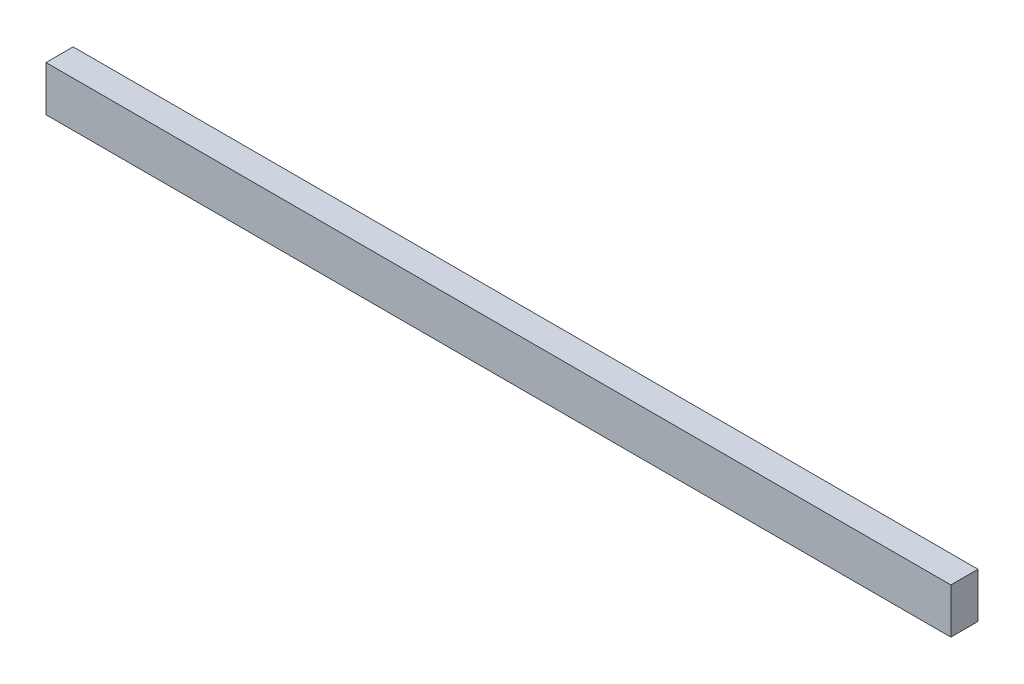
ISO-10303-21;
HEADER;
FILE_DESCRIPTION(('STEP AP214'),'2;1');
FILE_NAME('part.step','',(''),(''),'','','');
FILE_SCHEMA(('AUTOMOTIVE_DESIGN { 1 0 10303 214 1 1 1 1 }'));
ENDSEC;
DATA;
#1=APPLICATION_CONTEXT('core data for automotive mechanical design processes');
#2=APPLICATION_PROTOCOL_DEFINITION('international standard','automotive_design',2000,#1);
#3=PRODUCT_CONTEXT('',#1,'mechanical');
#4=PRODUCT('Part','Part','',(#3));
#5=PRODUCT_RELATED_PRODUCT_CATEGORY('part','',(#4));
#6=PRODUCT_DEFINITION_FORMATION('','',#4);
#7=PRODUCT_DEFINITION_CONTEXT('part definition',#1,'design');
#8=PRODUCT_DEFINITION('design','',#6,#7);
#9=PRODUCT_DEFINITION_SHAPE('','',#8);
#10=(LENGTH_UNIT() NAMED_UNIT(*) SI_UNIT(.MILLI.,.METRE.));
#11=(NAMED_UNIT(*) PLANE_ANGLE_UNIT() SI_UNIT($,.RADIAN.));
#12=(NAMED_UNIT(*) SI_UNIT($,.STERADIAN.) SOLID_ANGLE_UNIT());
#13=UNCERTAINTY_MEASURE_WITH_UNIT(LENGTH_MEASURE(1.E-05),#10,'distance_accuracy_value','');
#14=(GEOMETRIC_REPRESENTATION_CONTEXT(3) GLOBAL_UNCERTAINTY_ASSIGNED_CONTEXT((#13)) GLOBAL_UNIT_ASSIGNED_CONTEXT((#10,
#11,#12)) REPRESENTATION_CONTEXT('',''));
#15=CARTESIAN_POINT('',(0.,0.,0.));
#16=DIRECTION('',(0.,0.,1.));
#17=DIRECTION('',(1.,0.,0.));
#18=AXIS2_PLACEMENT_3D('',#15,#16,#17);
#19=CARTESIAN_POINT('',(0.,0.,6.));
#20=DIRECTION('',(1.,0.,0.));
#21=DIRECTION('',(0.,0.,-1.));
#22=AXIS2_PLACEMENT_3D('',#19,#20,#21);
#23=PLANE('',#22);
#24=DIRECTION('',(0.,-1.,0.));
#25=VECTOR('',#24,1.);
#26=CARTESIAN_POINT('',(0.,0.,0.));
#27=LINE('',#26,#25);
#28=CARTESIAN_POINT('',(0.,10.,0.));
#29=VERTEX_POINT('',#28);
#30=CARTESIAN_POINT('',(0.,0.,0.));
#31=VERTEX_POINT('',#30);
#32=EDGE_CURVE('E107',#29,#31,#27,.T.);
#33=ORIENTED_EDGE('',*,*,#32,.T.);
#34=DIRECTION('',(0.,0.,-1.));
#35=VECTOR('',#34,1.);
#36=CARTESIAN_POINT('',(0.,0.,6.));
#37=LINE('',#36,#35);
#38=CARTESIAN_POINT('',(0.,0.,6.));
#39=VERTEX_POINT('',#38);
#40=EDGE_CURVE('E11',#39,#31,#37,.T.);
#41=ORIENTED_EDGE('',*,*,#40,.F.);
#42=DIRECTION('',(0.,-1.,0.));
#43=VECTOR('',#42,1.);
#44=CARTESIAN_POINT('',(0.,0.,6.));
#45=LINE('',#44,#43);
#46=CARTESIAN_POINT('',(0.,10.,6.));
#47=VERTEX_POINT('',#46);
#48=EDGE_CURVE('E91',#47,#39,#45,.T.);
#49=ORIENTED_EDGE('',*,*,#48,.F.);
#50=DIRECTION('',(0.,0.,-1.));
#51=VECTOR('',#50,1.);
#52=CARTESIAN_POINT('',(0.,10.,6.));
#53=LINE('',#52,#51);
#54=EDGE_CURVE('E103',#47,#29,#53,.T.);
#55=ORIENTED_EDGE('',*,*,#54,.T.);
#56=EDGE_LOOP('',(#33,#41,#49,#55));
#57=FACE_BOUND('',#56,.T.);
#58=ADVANCED_FACE('F39',(#57),#23,.F.);
#59=CARTESIAN_POINT('',(0.,0.,6.));
#60=DIRECTION('',(0.,1.,0.));
#61=DIRECTION('',(0.,0.,1.));
#62=AXIS2_PLACEMENT_3D('',#59,#60,#61);
#63=PLANE('',#62);
#64=DIRECTION('',(1.,0.,0.));
#65=VECTOR('',#64,1.);
#66=CARTESIAN_POINT('',(0.,0.,0.));
#67=LINE('',#66,#65);
#68=CARTESIAN_POINT('',(200.,0.,0.));
#69=VERTEX_POINT('',#68);
#70=EDGE_CURVE('E96',#31,#69,#67,.T.);
#71=ORIENTED_EDGE('',*,*,#70,.T.);
#72=DIRECTION('',(0.,0.,-1.));
#73=VECTOR('',#72,1.);
#74=CARTESIAN_POINT('',(200.,0.,6.));
#75=LINE('',#74,#73);
#76=CARTESIAN_POINT('',(200.,0.,6.));
#77=VERTEX_POINT('',#76);
#78=EDGE_CURVE('E48',#77,#69,#75,.T.);
#79=ORIENTED_EDGE('',*,*,#78,.F.);
#80=DIRECTION('',(1.,0.,0.));
#81=VECTOR('',#80,1.);
#82=CARTESIAN_POINT('',(0.,0.,6.));
#83=LINE('',#82,#81);
#84=EDGE_CURVE('E86',#39,#77,#83,.T.);
#85=ORIENTED_EDGE('',*,*,#84,.F.);
#86=ORIENTED_EDGE('',*,*,#40,.T.);
#87=EDGE_LOOP('',(#71,#79,#85,#86));
#88=FACE_BOUND('',#87,.T.);
#89=ADVANCED_FACE('F95',(#88),#63,.F.);
#90=CARTESIAN_POINT('',(200.,0.,6.));
#91=DIRECTION('',(-1.,0.,0.));
#92=DIRECTION('',(0.,0.,1.));
#93=AXIS2_PLACEMENT_3D('',#90,#91,#92);
#94=PLANE('',#93);
#95=DIRECTION('',(0.,1.,0.));
#96=VECTOR('',#95,1.);
#97=CARTESIAN_POINT('',(200.,0.,0.));
#98=LINE('',#97,#96);
#99=CARTESIAN_POINT('',(200.,10.,0.));
#100=VERTEX_POINT('',#99);
#101=EDGE_CURVE('E73',#69,#100,#98,.T.);
#102=ORIENTED_EDGE('',*,*,#101,.T.);
#103=DIRECTION('',(0.,0.,-1.));
#104=VECTOR('',#103,1.);
#105=CARTESIAN_POINT('',(200.,10.,6.));
#106=LINE('',#105,#104);
#107=CARTESIAN_POINT('',(200.,10.,6.));
#108=VERTEX_POINT('',#107);
#109=EDGE_CURVE('E98',#108,#100,#106,.T.);
#110=ORIENTED_EDGE('',*,*,#109,.F.);
#111=DIRECTION('',(0.,1.,0.));
#112=VECTOR('',#111,1.);
#113=CARTESIAN_POINT('',(200.,0.,6.));
#114=LINE('',#113,#112);
#115=EDGE_CURVE('E89',#77,#108,#114,.T.);
#116=ORIENTED_EDGE('',*,*,#115,.F.);
#117=ORIENTED_EDGE('',*,*,#78,.T.);
#118=EDGE_LOOP('',(#102,#110,#116,#117));
#119=FACE_BOUND('',#118,.T.);
#120=ADVANCED_FACE('F99',(#119),#94,.F.);
#121=CARTESIAN_POINT('',(0.,10.,6.));
#122=DIRECTION('',(0.,-1.,0.));
#123=DIRECTION('',(0.,0.,-1.));
#124=AXIS2_PLACEMENT_3D('',#121,#122,#123);
#125=PLANE('',#124);
#126=DIRECTION('',(-1.,0.,0.));
#127=VECTOR('',#126,1.);
#128=CARTESIAN_POINT('',(0.,10.,0.));
#129=LINE('',#128,#127);
#130=EDGE_CURVE('E79',#100,#29,#129,.T.);
#131=ORIENTED_EDGE('',*,*,#130,.T.);
#132=ORIENTED_EDGE('',*,*,#54,.F.);
#133=DIRECTION('',(-1.,0.,0.));
#134=VECTOR('',#133,1.);
#135=CARTESIAN_POINT('',(0.,10.,6.));
#136=LINE('',#135,#134);
#137=EDGE_CURVE('E56',#108,#47,#136,.T.);
#138=ORIENTED_EDGE('',*,*,#137,.F.);
#139=ORIENTED_EDGE('',*,*,#109,.T.);
#140=EDGE_LOOP('',(#131,#132,#138,#139));
#141=FACE_BOUND('',#140,.T.);
#142=ADVANCED_FACE('F120',(#141),#125,.F.);
#143=CARTESIAN_POINT('',(0.,0.,6.));
#144=DIRECTION('',(0.,0.,-1.));
#145=DIRECTION('',(-1.,0.,0.));
#146=AXIS2_PLACEMENT_3D('',#143,#144,#145);
#147=PLANE('',#146);
#148=ORIENTED_EDGE('',*,*,#48,.T.);
#149=ORIENTED_EDGE('',*,*,#84,.T.);
#150=ORIENTED_EDGE('',*,*,#115,.T.);
#151=ORIENTED_EDGE('',*,*,#137,.T.);
#152=EDGE_LOOP('',(#148,#149,#150,#151));
#153=FACE_BOUND('',#152,.T.);
#154=ADVANCED_FACE('F87',(#153),#147,.F.);
#155=CARTESIAN_POINT('',(0.,0.,0.));
#156=DIRECTION('',(0.,0.,-1.));
#157=DIRECTION('',(-1.,0.,0.));
#158=AXIS2_PLACEMENT_3D('',#155,#156,#157);
#159=PLANE('',#158);
#160=ORIENTED_EDGE('',*,*,#32,.F.);
#161=ORIENTED_EDGE('',*,*,#130,.F.);
#162=ORIENTED_EDGE('',*,*,#101,.F.);
#163=ORIENTED_EDGE('',*,*,#70,.F.);
#164=EDGE_LOOP('',(#160,#161,#162,#163));
#165=FACE_BOUND('',#164,.T.);
#166=ADVANCED_FACE('F123',(#165),#159,.T.);
#167=CLOSED_SHELL('',(#58,#89,#120,#142,#154,#166));
#168=MANIFOLD_SOLID_BREP('B2',#167);
#169=ADVANCED_BREP_SHAPE_REPRESENTATION('',(#18,#168),#14);
#170=SHAPE_DEFINITION_REPRESENTATION(#9,#169);
ENDSEC;
END-ISO-10303-21;
